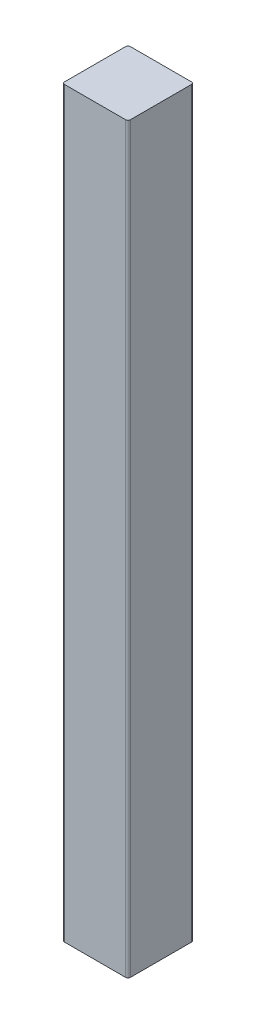
ISO-10303-21;
HEADER;
FILE_DESCRIPTION(('STEP AP214'),'2;1');
FILE_NAME('part.step','',(''),(''),'','','');
FILE_SCHEMA(('AUTOMOTIVE_DESIGN { 1 0 10303 214 1 1 1 1 }'));
ENDSEC;
DATA;
#1=APPLICATION_CONTEXT('core data for automotive mechanical design processes');
#2=APPLICATION_PROTOCOL_DEFINITION('international standard','automotive_design',2000,#1);
#3=PRODUCT_CONTEXT('',#1,'mechanical');
#4=PRODUCT('Part','Part','',(#3));
#5=PRODUCT_RELATED_PRODUCT_CATEGORY('part','',(#4));
#6=PRODUCT_DEFINITION_FORMATION('','',#4);
#7=PRODUCT_DEFINITION_CONTEXT('part definition',#1,'design');
#8=PRODUCT_DEFINITION('design','',#6,#7);
#9=PRODUCT_DEFINITION_SHAPE('','',#8);
#10=(LENGTH_UNIT() NAMED_UNIT(*) SI_UNIT(.MILLI.,.METRE.));
#11=(NAMED_UNIT(*) PLANE_ANGLE_UNIT() SI_UNIT($,.RADIAN.));
#12=(NAMED_UNIT(*) SI_UNIT($,.STERADIAN.) SOLID_ANGLE_UNIT());
#13=UNCERTAINTY_MEASURE_WITH_UNIT(LENGTH_MEASURE(1.E-05),#10,'distance_accuracy_value','');
#14=(GEOMETRIC_REPRESENTATION_CONTEXT(3) GLOBAL_UNCERTAINTY_ASSIGNED_CONTEXT((#13)) GLOBAL_UNIT_ASSIGNED_CONTEXT((#10,
#11,#12)) REPRESENTATION_CONTEXT('',''));
#15=CARTESIAN_POINT('',(0.,0.,0.));
#16=DIRECTION('',(0.,0.,1.));
#17=DIRECTION('',(1.,0.,0.));
#18=AXIS2_PLACEMENT_3D('',#15,#16,#17);
#19=CARTESIAN_POINT('',(44.45,1004.8875,44.45));
#20=DIRECTION('',(-1.,0.,0.));
#21=DIRECTION('',(0.,0.,1.));
#22=AXIS2_PLACEMENT_3D('',#19,#20,#21);
#23=PLANE('',#22);
#24=DIRECTION('',(0.,0.,-1.));
#25=VECTOR('',#24,1.);
#26=CARTESIAN_POINT('',(44.45,0.,44.45));
#27=LINE('',#26,#25);
#28=CARTESIAN_POINT('',(44.45,0.,41.275));
#29=VERTEX_POINT('',#28);
#30=CARTESIAN_POINT('',(44.45,0.,-41.275));
#31=VERTEX_POINT('',#30);
#32=EDGE_CURVE('E156',#29,#31,#27,.T.);
#33=ORIENTED_EDGE('',*,*,#32,.T.);
#34=DIRECTION('',(0.,-1.,0.));
#35=VECTOR('',#34,1.);
#36=CARTESIAN_POINT('',(44.45,1004.8875,-41.275));
#37=LINE('',#36,#35);
#38=CARTESIAN_POINT('',(44.45,1004.8875,-41.275));
#39=VERTEX_POINT('',#38);
#40=EDGE_CURVE('E11',#31,#39,#37,.F.);
#41=ORIENTED_EDGE('',*,*,#40,.T.);
#42=DIRECTION('',(0.,0.,-1.));
#43=VECTOR('',#42,1.);
#44=CARTESIAN_POINT('',(44.45,1004.8875,44.45));
#45=LINE('',#44,#43);
#46=CARTESIAN_POINT('',(44.45,1004.8875,41.275));
#47=VERTEX_POINT('',#46);
#48=EDGE_CURVE('E124',#47,#39,#45,.T.);
#49=ORIENTED_EDGE('',*,*,#48,.F.);
#50=DIRECTION('',(0.,-1.,0.));
#51=VECTOR('',#50,1.);
#52=CARTESIAN_POINT('',(44.45,1004.8875,41.275));
#53=LINE('',#52,#51);
#54=EDGE_CURVE('E40',#47,#29,#53,.T.);
#55=ORIENTED_EDGE('',*,*,#54,.T.);
#56=EDGE_LOOP('',(#33,#41,#49,#55));
#57=FACE_BOUND('',#56,.T.);
#58=ADVANCED_FACE('F32',(#57),#23,.F.);
#59=CARTESIAN_POINT('',(-44.45,1004.8875,-44.45));
#60=DIRECTION('',(0.,0.,1.));
#61=DIRECTION('',(1.,0.,0.));
#62=AXIS2_PLACEMENT_3D('',#59,#60,#61);
#63=PLANE('',#62);
#64=DIRECTION('',(-1.,0.,0.));
#65=VECTOR('',#64,1.);
#66=CARTESIAN_POINT('',(-44.45,0.,-44.45));
#67=LINE('',#66,#65);
#68=CARTESIAN_POINT('',(41.275,0.,-44.45));
#69=VERTEX_POINT('',#68);
#70=CARTESIAN_POINT('',(-41.275,0.,-44.45));
#71=VERTEX_POINT('',#70);
#72=EDGE_CURVE('E129',#69,#71,#67,.T.);
#73=ORIENTED_EDGE('',*,*,#72,.T.);
#74=DIRECTION('',(0.,-1.,0.));
#75=VECTOR('',#74,1.);
#76=CARTESIAN_POINT('',(-41.275,1004.8875,-44.45));
#77=LINE('',#76,#75);
#78=CARTESIAN_POINT('',(-41.275,1004.8875,-44.45));
#79=VERTEX_POINT('',#78);
#80=EDGE_CURVE('E47',#71,#79,#77,.F.);
#81=ORIENTED_EDGE('',*,*,#80,.T.);
#82=DIRECTION('',(-1.,0.,0.));
#83=VECTOR('',#82,1.);
#84=CARTESIAN_POINT('',(-44.45,1004.8875,-44.45));
#85=LINE('',#84,#83);
#86=CARTESIAN_POINT('',(41.275,1004.8875,-44.45));
#87=VERTEX_POINT('',#86);
#88=EDGE_CURVE('E127',#87,#79,#85,.T.);
#89=ORIENTED_EDGE('',*,*,#88,.F.);
#90=DIRECTION('',(0.,-1.,0.));
#91=VECTOR('',#90,1.);
#92=CARTESIAN_POINT('',(41.275,1004.8875,-44.45));
#93=LINE('',#92,#91);
#94=EDGE_CURVE('E148',#87,#69,#93,.T.);
#95=ORIENTED_EDGE('',*,*,#94,.T.);
#96=EDGE_LOOP('',(#73,#81,#89,#95));
#97=FACE_BOUND('',#96,.T.);
#98=ADVANCED_FACE('F176',(#97),#63,.F.);
#99=CARTESIAN_POINT('',(-44.45,1004.8875,44.45));
#100=DIRECTION('',(1.,0.,0.));
#101=DIRECTION('',(0.,0.,-1.));
#102=AXIS2_PLACEMENT_3D('',#99,#100,#101);
#103=PLANE('',#102);
#104=DIRECTION('',(0.,0.,1.));
#105=VECTOR('',#104,1.);
#106=CARTESIAN_POINT('',(-44.45,0.,44.45));
#107=LINE('',#106,#105);
#108=CARTESIAN_POINT('',(-44.45,0.,-41.275));
#109=VERTEX_POINT('',#108);
#110=CARTESIAN_POINT('',(-44.45,0.,41.275));
#111=VERTEX_POINT('',#110);
#112=EDGE_CURVE('E125',#109,#111,#107,.T.);
#113=ORIENTED_EDGE('',*,*,#112,.T.);
#114=DIRECTION('',(0.,-1.,0.));
#115=VECTOR('',#114,1.);
#116=CARTESIAN_POINT('',(-44.45,1004.8875,41.275));
#117=LINE('',#116,#115);
#118=CARTESIAN_POINT('',(-44.45,1004.8875,41.275));
#119=VERTEX_POINT('',#118);
#120=EDGE_CURVE('E103',#111,#119,#117,.F.);
#121=ORIENTED_EDGE('',*,*,#120,.T.);
#122=DIRECTION('',(0.,0.,1.));
#123=VECTOR('',#122,1.);
#124=CARTESIAN_POINT('',(-44.45,1004.8875,44.45));
#125=LINE('',#124,#123);
#126=CARTESIAN_POINT('',(-44.45,1004.8875,-41.275));
#127=VERTEX_POINT('',#126);
#128=EDGE_CURVE('E164',#127,#119,#125,.T.);
#129=ORIENTED_EDGE('',*,*,#128,.F.);
#130=DIRECTION('',(0.,-1.,0.));
#131=VECTOR('',#130,1.);
#132=CARTESIAN_POINT('',(-44.45,1004.8875,-41.275));
#133=LINE('',#132,#131);
#134=EDGE_CURVE('E108',#127,#109,#133,.T.);
#135=ORIENTED_EDGE('',*,*,#134,.T.);
#136=EDGE_LOOP('',(#113,#121,#129,#135));
#137=FACE_BOUND('',#136,.T.);
#138=ADVANCED_FACE('F175',(#137),#103,.F.);
#139=CARTESIAN_POINT('',(-44.45,1004.8875,44.45));
#140=DIRECTION('',(0.,0.,-1.));
#141=DIRECTION('',(-1.,0.,0.));
#142=AXIS2_PLACEMENT_3D('',#139,#140,#141);
#143=PLANE('',#142);
#144=DIRECTION('',(1.,0.,0.));
#145=VECTOR('',#144,1.);
#146=CARTESIAN_POINT('',(-44.45,1004.8875,44.45));
#147=LINE('',#146,#145);
#148=CARTESIAN_POINT('',(-41.275,1004.8875,44.45));
#149=VERTEX_POINT('',#148);
#150=CARTESIAN_POINT('',(41.275,1004.8875,44.45));
#151=VERTEX_POINT('',#150);
#152=EDGE_CURVE('E118',#149,#151,#147,.T.);
#153=ORIENTED_EDGE('',*,*,#152,.F.);
#154=DIRECTION('',(0.,-1.,0.));
#155=VECTOR('',#154,1.);
#156=CARTESIAN_POINT('',(-41.275,1004.8875,44.45));
#157=LINE('',#156,#155);
#158=CARTESIAN_POINT('',(-41.275,0.,44.45));
#159=VERTEX_POINT('',#158);
#160=EDGE_CURVE('E102',#149,#159,#157,.T.);
#161=ORIENTED_EDGE('',*,*,#160,.T.);
#162=DIRECTION('',(1.,0.,0.));
#163=VECTOR('',#162,1.);
#164=CARTESIAN_POINT('',(-44.45,0.,44.45));
#165=LINE('',#164,#163);
#166=CARTESIAN_POINT('',(41.275,0.,44.45));
#167=VERTEX_POINT('',#166);
#168=EDGE_CURVE('E115',#159,#167,#165,.T.);
#169=ORIENTED_EDGE('',*,*,#168,.T.);
#170=DIRECTION('',(0.,-1.,0.));
#171=VECTOR('',#170,1.);
#172=CARTESIAN_POINT('',(41.275,1004.8875,44.45));
#173=LINE('',#172,#171);
#174=EDGE_CURVE('E120',#167,#151,#173,.F.);
#175=ORIENTED_EDGE('',*,*,#174,.T.);
#176=EDGE_LOOP('',(#153,#161,#169,#175));
#177=FACE_BOUND('',#176,.T.);
#178=ADVANCED_FACE('F114',(#177),#143,.F.);
#179=CARTESIAN_POINT('',(0.,1004.8875,0.));
#180=DIRECTION('',(0.,-1.,0.));
#181=DIRECTION('',(0.,0.,-1.));
#182=AXIS2_PLACEMENT_3D('',#179,#180,#181);
#183=PLANE('',#182);
#184=ORIENTED_EDGE('',*,*,#128,.T.);
#185=CARTESIAN_POINT('',(-41.275,1004.8875,41.275));
#186=DIRECTION('',(0.,-1.,0.));
#187=DIRECTION('',(0.,0.,-1.));
#188=AXIS2_PLACEMENT_3D('',#185,#186,#187);
#189=CIRCLE('',#188,3.175);
#190=EDGE_CURVE('E146',#119,#149,#189,.F.);
#191=ORIENTED_EDGE('',*,*,#190,.T.);
#192=ORIENTED_EDGE('',*,*,#152,.T.);
#193=CARTESIAN_POINT('',(41.275,1004.8875,41.275));
#194=DIRECTION('',(0.,-1.,0.));
#195=DIRECTION('',(0.,0.,-1.));
#196=AXIS2_PLACEMENT_3D('',#193,#194,#195);
#197=CIRCLE('',#196,3.175);
#198=EDGE_CURVE('E141',#151,#47,#197,.F.);
#199=ORIENTED_EDGE('',*,*,#198,.T.);
#200=ORIENTED_EDGE('',*,*,#48,.T.);
#201=CARTESIAN_POINT('',(41.275,1004.8875,-41.275));
#202=DIRECTION('',(0.,-1.,0.));
#203=DIRECTION('',(0.,0.,-1.));
#204=AXIS2_PLACEMENT_3D('',#201,#202,#203);
#205=CIRCLE('',#204,3.175);
#206=EDGE_CURVE('E54',#39,#87,#205,.F.);
#207=ORIENTED_EDGE('',*,*,#206,.T.);
#208=ORIENTED_EDGE('',*,*,#88,.T.);
#209=CARTESIAN_POINT('',(-41.275,1004.8875,-41.275));
#210=DIRECTION('',(0.,-1.,0.));
#211=DIRECTION('',(0.,0.,-1.));
#212=AXIS2_PLACEMENT_3D('',#209,#210,#211);
#213=CIRCLE('',#212,3.175);
#214=EDGE_CURVE('E144',#79,#127,#213,.F.);
#215=ORIENTED_EDGE('',*,*,#214,.T.);
#216=EDGE_LOOP('',(#184,#191,#192,#199,#200,#207,#208,#215));
#217=FACE_BOUND('',#216,.T.);
#218=ADVANCED_FACE('F168',(#217),#183,.F.);
#219=CARTESIAN_POINT('',(0.,0.,0.));
#220=DIRECTION('',(0.,-1.,0.));
#221=DIRECTION('',(0.,0.,-1.));
#222=AXIS2_PLACEMENT_3D('',#219,#220,#221);
#223=PLANE('',#222);
#224=ORIENTED_EDGE('',*,*,#168,.F.);
#225=CARTESIAN_POINT('',(-41.275,0.,41.275));
#226=DIRECTION('',(0.,-1.,0.));
#227=DIRECTION('',(0.,0.,-1.));
#228=AXIS2_PLACEMENT_3D('',#225,#226,#227);
#229=CIRCLE('',#228,3.175);
#230=EDGE_CURVE('E98',#159,#111,#229,.T.);
#231=ORIENTED_EDGE('',*,*,#230,.T.);
#232=ORIENTED_EDGE('',*,*,#112,.F.);
#233=CARTESIAN_POINT('',(-41.275,0.,-41.275));
#234=DIRECTION('',(0.,-1.,0.));
#235=DIRECTION('',(0.,0.,-1.));
#236=AXIS2_PLACEMENT_3D('',#233,#234,#235);
#237=CIRCLE('',#236,3.175);
#238=EDGE_CURVE('E109',#109,#71,#237,.T.);
#239=ORIENTED_EDGE('',*,*,#238,.T.);
#240=ORIENTED_EDGE('',*,*,#72,.F.);
#241=CARTESIAN_POINT('',(41.275,0.,-41.275));
#242=DIRECTION('',(0.,-1.,0.));
#243=DIRECTION('',(0.,0.,-1.));
#244=AXIS2_PLACEMENT_3D('',#241,#242,#243);
#245=CIRCLE('',#244,3.175);
#246=EDGE_CURVE('E135',#69,#31,#245,.T.);
#247=ORIENTED_EDGE('',*,*,#246,.T.);
#248=ORIENTED_EDGE('',*,*,#32,.F.);
#249=CARTESIAN_POINT('',(41.275,0.,41.275));
#250=DIRECTION('',(0.,-1.,0.));
#251=DIRECTION('',(0.,0.,-1.));
#252=AXIS2_PLACEMENT_3D('',#249,#250,#251);
#253=CIRCLE('',#252,3.175);
#254=EDGE_CURVE('E119',#29,#167,#253,.T.);
#255=ORIENTED_EDGE('',*,*,#254,.T.);
#256=EDGE_LOOP('',(#224,#231,#232,#239,#240,#247,#248,#255));
#257=FACE_BOUND('',#256,.T.);
#258=ADVANCED_FACE('F122',(#257),#223,.T.);
#259=CARTESIAN_POINT('',(-41.275,1004.8875,41.275));
#260=DIRECTION('',(0.,-1.,0.));
#261=DIRECTION('',(0.,0.,-1.));
#262=AXIS2_PLACEMENT_3D('',#259,#260,#261);
#263=CYLINDRICAL_SURFACE('',#262,3.175);
#264=ORIENTED_EDGE('',*,*,#190,.F.);
#265=ORIENTED_EDGE('',*,*,#120,.F.);
#266=ORIENTED_EDGE('',*,*,#230,.F.);
#267=ORIENTED_EDGE('',*,*,#160,.F.);
#268=EDGE_LOOP('',(#264,#265,#266,#267));
#269=FACE_BOUND('',#268,.T.);
#270=ADVANCED_FACE('F101',(#269),#263,.T.);
#271=CARTESIAN_POINT('',(-41.275,1004.8875,-41.275));
#272=DIRECTION('',(0.,-1.,0.));
#273=DIRECTION('',(0.,0.,-1.));
#274=AXIS2_PLACEMENT_3D('',#271,#272,#273);
#275=CYLINDRICAL_SURFACE('',#274,3.175);
#276=ORIENTED_EDGE('',*,*,#214,.F.);
#277=ORIENTED_EDGE('',*,*,#80,.F.);
#278=ORIENTED_EDGE('',*,*,#238,.F.);
#279=ORIENTED_EDGE('',*,*,#134,.F.);
#280=EDGE_LOOP('',(#276,#277,#278,#279));
#281=FACE_BOUND('',#280,.T.);
#282=ADVANCED_FACE('F173',(#281),#275,.T.);
#283=CARTESIAN_POINT('',(41.275,1004.8875,-41.275));
#284=DIRECTION('',(0.,-1.,0.));
#285=DIRECTION('',(0.,0.,-1.));
#286=AXIS2_PLACEMENT_3D('',#283,#284,#285);
#287=CYLINDRICAL_SURFACE('',#286,3.175);
#288=ORIENTED_EDGE('',*,*,#206,.F.);
#289=ORIENTED_EDGE('',*,*,#40,.F.);
#290=ORIENTED_EDGE('',*,*,#246,.F.);
#291=ORIENTED_EDGE('',*,*,#94,.F.);
#292=EDGE_LOOP('',(#288,#289,#290,#291));
#293=FACE_BOUND('',#292,.T.);
#294=ADVANCED_FACE('F178',(#293),#287,.T.);
#295=CARTESIAN_POINT('',(41.275,1004.8875,41.275));
#296=DIRECTION('',(0.,-1.,0.));
#297=DIRECTION('',(0.,0.,-1.));
#298=AXIS2_PLACEMENT_3D('',#295,#296,#297);
#299=CYLINDRICAL_SURFACE('',#298,3.175);
#300=ORIENTED_EDGE('',*,*,#198,.F.);
#301=ORIENTED_EDGE('',*,*,#174,.F.);
#302=ORIENTED_EDGE('',*,*,#254,.F.);
#303=ORIENTED_EDGE('',*,*,#54,.F.);
#304=EDGE_LOOP('',(#300,#301,#302,#303));
#305=FACE_BOUND('',#304,.T.);
#306=ADVANCED_FACE('F34',(#305),#299,.T.);
#307=CLOSED_SHELL('',(#58,#98,#138,#178,#218,#258,#270,#282,#294,#306));
#308=MANIFOLD_SOLID_BREP('B2',#307);
#309=ADVANCED_BREP_SHAPE_REPRESENTATION('',(#18,#308),#14);
#310=SHAPE_DEFINITION_REPRESENTATION(#9,#309);
ENDSEC;
END-ISO-10303-21;
